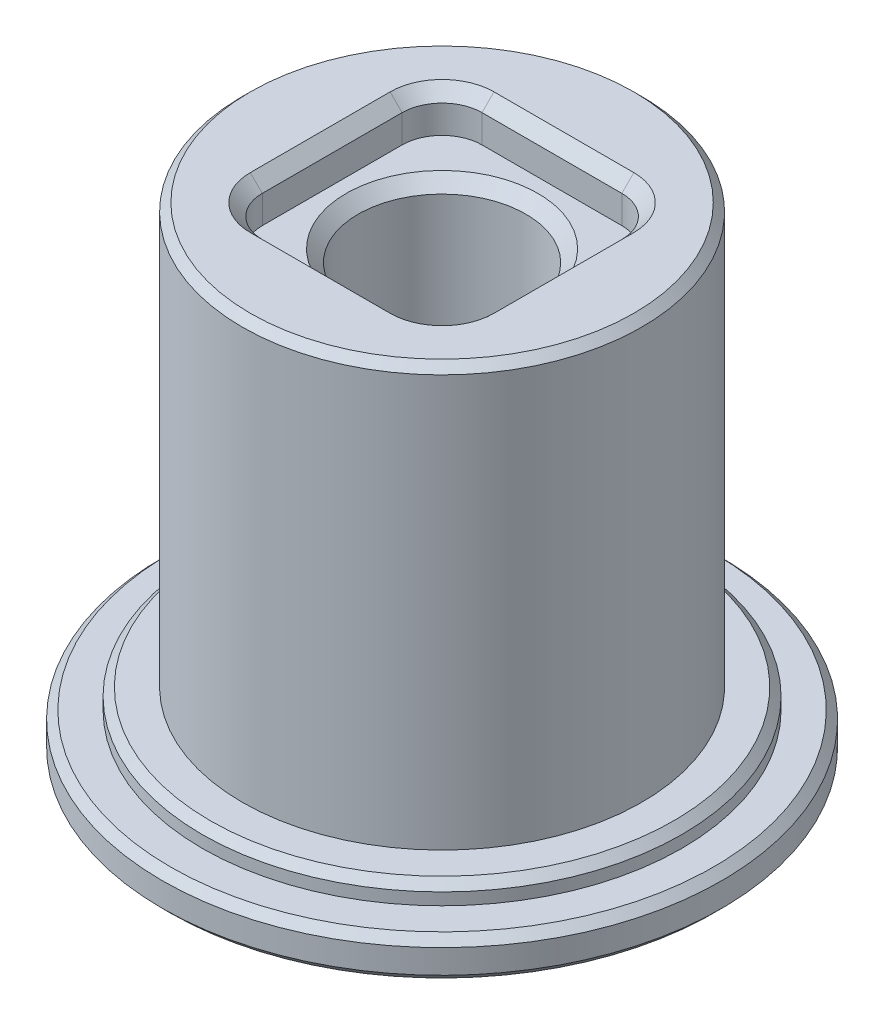
ISO-10303-21;
HEADER;
FILE_DESCRIPTION(('STEP AP214'),'2;1');
FILE_NAME('part.step','',(''),(''),'','','');
FILE_SCHEMA(('AUTOMOTIVE_DESIGN { 1 0 10303 214 1 1 1 1 }'));
ENDSEC;
DATA;
#1=APPLICATION_CONTEXT('core data for automotive mechanical design processes');
#2=APPLICATION_PROTOCOL_DEFINITION('international standard','automotive_design',2000,#1);
#3=PRODUCT_CONTEXT('',#1,'mechanical');
#4=PRODUCT('Part','Part','',(#3));
#5=PRODUCT_RELATED_PRODUCT_CATEGORY('part','',(#4));
#6=PRODUCT_DEFINITION_FORMATION('','',#4);
#7=PRODUCT_DEFINITION_CONTEXT('part definition',#1,'design');
#8=PRODUCT_DEFINITION('design','',#6,#7);
#9=PRODUCT_DEFINITION_SHAPE('','',#8);
#10=(LENGTH_UNIT() NAMED_UNIT(*) SI_UNIT(.MILLI.,.METRE.));
#11=(NAMED_UNIT(*) PLANE_ANGLE_UNIT() SI_UNIT($,.RADIAN.));
#12=(NAMED_UNIT(*) SI_UNIT($,.STERADIAN.) SOLID_ANGLE_UNIT());
#13=UNCERTAINTY_MEASURE_WITH_UNIT(LENGTH_MEASURE(1.E-05),#10,'distance_accuracy_value','');
#14=(GEOMETRIC_REPRESENTATION_CONTEXT(3) GLOBAL_UNCERTAINTY_ASSIGNED_CONTEXT((#13)) GLOBAL_UNIT_ASSIGNED_CONTEXT((#10,
#11,#12)) REPRESENTATION_CONTEXT('',''));
#15=CARTESIAN_POINT('',(0.,0.,0.));
#16=DIRECTION('',(0.,0.,1.));
#17=DIRECTION('',(1.,0.,0.));
#18=AXIS2_PLACEMENT_3D('',#15,#16,#17);
#19=CARTESIAN_POINT('',(0.,12.,0.));
#20=DIRECTION('',(0.,-1.,0.));
#21=DIRECTION('',(0.,0.,-1.));
#22=AXIS2_PLACEMENT_3D('',#19,#20,#21);
#23=CYLINDRICAL_SURFACE('',#22,4.25);
#24=CARTESIAN_POINT('',(0.,0.300000000000005,0.));
#25=DIRECTION('',(0.,1.,0.));
#26=DIRECTION('',(0.,0.,1.));
#27=AXIS2_PLACEMENT_3D('',#24,#25,#26);
#28=CIRCLE('',#27,4.25);
#29=CARTESIAN_POINT('',(0.,0.300000000000005,-4.25));
#30=VERTEX_POINT('',#29);
#31=EDGE_CURVE('E215',#30,#30,#28,.F.);
#32=ORIENTED_EDGE('',*,*,#31,.T.);
#33=EDGE_LOOP('',(#32));
#34=FACE_BOUND('',#33,.T.);
#35=CARTESIAN_POINT('',(0.,5.,0.));
#36=DIRECTION('',(0.,1.,0.));
#37=DIRECTION('',(0.,0.,1.));
#38=AXIS2_PLACEMENT_3D('',#35,#36,#37);
#39=CIRCLE('',#38,4.25);
#40=CARTESIAN_POINT('',(0.,5.,4.25));
#41=VERTEX_POINT('',#40);
#42=EDGE_CURVE('E285',#41,#41,#39,.T.);
#43=ORIENTED_EDGE('',*,*,#42,.T.);
#44=EDGE_LOOP('',(#43));
#45=FACE_BOUND('',#44,.T.);
#46=ADVANCED_FACE('F43',(#34,#45),#23,.F.);
#47=CARTESIAN_POINT('',(0.,1.,0.));
#48=DIRECTION('',(0.,-1.,0.));
#49=DIRECTION('',(0.,0.,-1.));
#50=AXIS2_PLACEMENT_3D('',#47,#48,#49);
#51=CYLINDRICAL_SURFACE('',#50,7.);
#52=CARTESIAN_POINT('',(0.,0.800000000000001,0.));
#53=DIRECTION('',(0.,1.,0.));
#54=DIRECTION('',(0.,0.,1.));
#55=AXIS2_PLACEMENT_3D('',#52,#53,#54);
#56=CIRCLE('',#55,7.);
#57=CARTESIAN_POINT('',(0.,0.800000000000001,7.));
#58=VERTEX_POINT('',#57);
#59=EDGE_CURVE('E206',#58,#58,#56,.F.);
#60=ORIENTED_EDGE('',*,*,#59,.T.);
#61=EDGE_LOOP('',(#60));
#62=FACE_BOUND('',#61,.T.);
#63=CARTESIAN_POINT('',(0.,0.200000000000003,0.));
#64=DIRECTION('',(0.,1.,0.));
#65=DIRECTION('',(0.,0.,1.));
#66=AXIS2_PLACEMENT_3D('',#63,#64,#65);
#67=CIRCLE('',#66,7.);
#68=CARTESIAN_POINT('',(0.,0.200000000000003,7.));
#69=VERTEX_POINT('',#68);
#70=EDGE_CURVE('E203',#69,#69,#67,.T.);
#71=ORIENTED_EDGE('',*,*,#70,.T.);
#72=EDGE_LOOP('',(#71));
#73=FACE_BOUND('',#72,.T.);
#74=ADVANCED_FACE('F309',(#62,#73),#51,.T.);
#75=CARTESIAN_POINT('',(0.,1.,0.));
#76=DIRECTION('',(0.,1.,0.));
#77=DIRECTION('',(0.,0.,1.));
#78=AXIS2_PLACEMENT_3D('',#75,#76,#77);
#79=PLANE('',#78);
#80=CARTESIAN_POINT('',(0.,1.,0.));
#81=DIRECTION('',(0.,1.,0.));
#82=DIRECTION('',(0.,0.,1.));
#83=AXIS2_PLACEMENT_3D('',#80,#81,#82);
#84=CIRCLE('',#83,6.8);
#85=CARTESIAN_POINT('',(0.,1.,6.8));
#86=VERTEX_POINT('',#85);
#87=EDGE_CURVE('E200',#86,#86,#84,.T.);
#88=ORIENTED_EDGE('',*,*,#87,.T.);
#89=EDGE_LOOP('',(#88));
#90=FACE_BOUND('',#89,.T.);
#91=CARTESIAN_POINT('',(0.,1.,0.));
#92=DIRECTION('',(0.,1.,0.));
#93=DIRECTION('',(0.,0.,1.));
#94=AXIS2_PLACEMENT_3D('',#91,#92,#93);
#95=CIRCLE('',#94,6.);
#96=CARTESIAN_POINT('',(0.,1.,6.));
#97=VERTEX_POINT('',#96);
#98=EDGE_CURVE('E162',#97,#97,#95,.T.);
#99=ORIENTED_EDGE('',*,*,#98,.F.);
#100=EDGE_LOOP('',(#99));
#101=FACE_BOUND('',#100,.T.);
#102=ADVANCED_FACE('F314',(#90,#101),#79,.T.);
#103=CARTESIAN_POINT('',(0.,0.,0.));
#104=DIRECTION('',(0.,1.,0.));
#105=DIRECTION('',(0.,0.,1.));
#106=AXIS2_PLACEMENT_3D('',#103,#104,#105);
#107=PLANE('',#106);
#108=CARTESIAN_POINT('',(0.,0.,0.));
#109=DIRECTION('',(0.,1.,0.));
#110=DIRECTION('',(0.,0.,1.));
#111=AXIS2_PLACEMENT_3D('',#108,#109,#110);
#112=CIRCLE('',#111,4.55000000000001);
#113=CARTESIAN_POINT('',(0.,0.,-4.55000000000001));
#114=VERTEX_POINT('',#113);
#115=EDGE_CURVE('E212',#114,#114,#112,.T.);
#116=ORIENTED_EDGE('',*,*,#115,.T.);
#117=EDGE_LOOP('',(#116));
#118=FACE_BOUND('',#117,.T.);
#119=CARTESIAN_POINT('',(0.,0.,0.));
#120=DIRECTION('',(0.,1.,0.));
#121=DIRECTION('',(0.,0.,1.));
#122=AXIS2_PLACEMENT_3D('',#119,#120,#121);
#123=CIRCLE('',#122,6.8);
#124=CARTESIAN_POINT('',(0.,0.,6.8));
#125=VERTEX_POINT('',#124);
#126=EDGE_CURVE('E209',#125,#125,#123,.F.);
#127=ORIENTED_EDGE('',*,*,#126,.T.);
#128=EDGE_LOOP('',(#127));
#129=FACE_BOUND('',#128,.T.);
#130=ADVANCED_FACE('F304',(#118,#129),#107,.F.);
#131=CARTESIAN_POINT('',(0.,1.5,0.));
#132=DIRECTION('',(0.,-1.,0.));
#133=DIRECTION('',(0.,0.,-1.));
#134=AXIS2_PLACEMENT_3D('',#131,#132,#133);
#135=CYLINDRICAL_SURFACE('',#134,6.);
#136=CARTESIAN_POINT('',(0.,1.3,0.));
#137=DIRECTION('',(0.,1.,0.));
#138=DIRECTION('',(0.,0.,1.));
#139=AXIS2_PLACEMENT_3D('',#136,#137,#138);
#140=CIRCLE('',#139,6.);
#141=CARTESIAN_POINT('',(0.,1.3,6.));
#142=VERTEX_POINT('',#141);
#143=EDGE_CURVE('E191',#142,#142,#140,.F.);
#144=ORIENTED_EDGE('',*,*,#143,.T.);
#145=EDGE_LOOP('',(#144));
#146=FACE_BOUND('',#145,.T.);
#147=ORIENTED_EDGE('',*,*,#98,.T.);
#148=EDGE_LOOP('',(#147));
#149=FACE_BOUND('',#148,.T.);
#150=ADVANCED_FACE('F294',(#146,#149),#135,.T.);
#151=CARTESIAN_POINT('',(0.,1.5,0.));
#152=DIRECTION('',(0.,1.,0.));
#153=DIRECTION('',(0.,0.,1.));
#154=AXIS2_PLACEMENT_3D('',#151,#152,#153);
#155=PLANE('',#154);
#156=CARTESIAN_POINT('',(0.,1.5,0.));
#157=DIRECTION('',(0.,1.,0.));
#158=DIRECTION('',(0.,0.,1.));
#159=AXIS2_PLACEMENT_3D('',#156,#157,#158);
#160=CIRCLE('',#159,5.8);
#161=CARTESIAN_POINT('',(0.,1.5,5.8));
#162=VERTEX_POINT('',#161);
#163=EDGE_CURVE('E188',#162,#162,#160,.T.);
#164=ORIENTED_EDGE('',*,*,#163,.T.);
#165=EDGE_LOOP('',(#164));
#166=FACE_BOUND('',#165,.T.);
#167=CARTESIAN_POINT('',(0.,1.5,0.));
#168=DIRECTION('',(0.,1.,0.));
#169=DIRECTION('',(0.,0.,1.));
#170=AXIS2_PLACEMENT_3D('',#167,#168,#169);
#171=CIRCLE('',#170,5.);
#172=CARTESIAN_POINT('',(0.,1.5,5.));
#173=VERTEX_POINT('',#172);
#174=EDGE_CURVE('E167',#173,#173,#171,.T.);
#175=ORIENTED_EDGE('',*,*,#174,.F.);
#176=EDGE_LOOP('',(#175));
#177=FACE_BOUND('',#176,.T.);
#178=ADVANCED_FACE('F292',(#166,#177),#155,.T.);
#179=CARTESIAN_POINT('',(0.,12.,0.));
#180=DIRECTION('',(0.,-1.,0.));
#181=DIRECTION('',(0.,0.,-1.));
#182=AXIS2_PLACEMENT_3D('',#179,#180,#181);
#183=CYLINDRICAL_SURFACE('',#182,5.);
#184=CARTESIAN_POINT('',(0.,11.8,0.));
#185=DIRECTION('',(0.,1.,0.));
#186=DIRECTION('',(0.,0.,1.));
#187=AXIS2_PLACEMENT_3D('',#184,#185,#186);
#188=CIRCLE('',#187,5.);
#189=CARTESIAN_POINT('',(0.,11.8,5.));
#190=VERTEX_POINT('',#189);
#191=EDGE_CURVE('E197',#190,#190,#188,.F.);
#192=ORIENTED_EDGE('',*,*,#191,.T.);
#193=EDGE_LOOP('',(#192));
#194=FACE_BOUND('',#193,.T.);
#195=ORIENTED_EDGE('',*,*,#174,.T.);
#196=EDGE_LOOP('',(#195));
#197=FACE_BOUND('',#196,.T.);
#198=ADVANCED_FACE('F290',(#194,#197),#183,.T.);
#199=CARTESIAN_POINT('',(0.,12.,0.));
#200=DIRECTION('',(0.,1.,0.));
#201=DIRECTION('',(0.,0.,1.));
#202=AXIS2_PLACEMENT_3D('',#199,#200,#201);
#203=PLANE('',#202);
#204=CARTESIAN_POINT('',(1.75,12.,1.75));
#205=DIRECTION('',(0.,1.,0.));
#206=DIRECTION('',(0.,0.,1.));
#207=AXIS2_PLACEMENT_3D('',#204,#205,#206);
#208=CIRCLE('',#207,1.3);
#209=CARTESIAN_POINT('',(3.05000000000001,12.,1.75));
#210=VERTEX_POINT('',#209);
#211=CARTESIAN_POINT('',(1.75,12.,3.05));
#212=VERTEX_POINT('',#211);
#213=EDGE_CURVE('E236',#210,#212,#208,.F.);
#214=ORIENTED_EDGE('',*,*,#213,.T.);
#215=DIRECTION('',(-1.,0.,0.));
#216=VECTOR('',#215,1.);
#217=CARTESIAN_POINT('',(0.,12.,3.05000000000001));
#218=LINE('',#217,#216);
#219=CARTESIAN_POINT('',(-1.75,12.,3.05));
#220=VERTEX_POINT('',#219);
#221=EDGE_CURVE('E240',#212,#220,#218,.T.);
#222=ORIENTED_EDGE('',*,*,#221,.T.);
#223=CARTESIAN_POINT('',(-1.75,12.,1.75));
#224=DIRECTION('',(0.,1.,0.));
#225=DIRECTION('',(0.,0.,1.));
#226=AXIS2_PLACEMENT_3D('',#223,#224,#225);
#227=CIRCLE('',#226,1.3);
#228=CARTESIAN_POINT('',(-3.05,12.,1.75));
#229=VERTEX_POINT('',#228);
#230=EDGE_CURVE('E238',#220,#229,#227,.F.);
#231=ORIENTED_EDGE('',*,*,#230,.T.);
#232=DIRECTION('',(0.,0.,-1.));
#233=VECTOR('',#232,1.);
#234=CARTESIAN_POINT('',(-3.05,12.,-1.75));
#235=LINE('',#234,#233);
#236=CARTESIAN_POINT('',(-3.05,12.,-1.75));
#237=VERTEX_POINT('',#236);
#238=EDGE_CURVE('E232',#229,#237,#235,.T.);
#239=ORIENTED_EDGE('',*,*,#238,.T.);
#240=CARTESIAN_POINT('',(-1.75,12.,-1.75));
#241=DIRECTION('',(0.,1.,0.));
#242=DIRECTION('',(0.,0.,1.));
#243=AXIS2_PLACEMENT_3D('',#240,#241,#242);
#244=CIRCLE('',#243,1.3);
#245=CARTESIAN_POINT('',(-1.75,12.,-3.05));
#246=VERTEX_POINT('',#245);
#247=EDGE_CURVE('E230',#237,#246,#244,.F.);
#248=ORIENTED_EDGE('',*,*,#247,.T.);
#249=DIRECTION('',(1.,0.,0.));
#250=VECTOR('',#249,1.);
#251=CARTESIAN_POINT('',(1.75,12.,-3.05));
#252=LINE('',#251,#250);
#253=CARTESIAN_POINT('',(1.75,12.,-3.05));
#254=VERTEX_POINT('',#253);
#255=EDGE_CURVE('E226',#246,#254,#252,.T.);
#256=ORIENTED_EDGE('',*,*,#255,.T.);
#257=CARTESIAN_POINT('',(1.75,12.,-1.75));
#258=DIRECTION('',(0.,1.,0.));
#259=DIRECTION('',(0.,0.,1.));
#260=AXIS2_PLACEMENT_3D('',#257,#258,#259);
#261=CIRCLE('',#260,1.3);
#262=CARTESIAN_POINT('',(3.05,12.,-1.75));
#263=VERTEX_POINT('',#262);
#264=EDGE_CURVE('E228',#254,#263,#261,.F.);
#265=ORIENTED_EDGE('',*,*,#264,.T.);
#266=DIRECTION('',(0.,0.,1.));
#267=VECTOR('',#266,1.);
#268=CARTESIAN_POINT('',(3.05000000000001,12.,0.));
#269=LINE('',#268,#267);
#270=EDGE_CURVE('E234',#263,#210,#269,.T.);
#271=ORIENTED_EDGE('',*,*,#270,.T.);
#272=EDGE_LOOP('',(#214,#222,#231,#239,#248,#256,#265,#271));
#273=FACE_BOUND('',#272,.T.);
#274=CARTESIAN_POINT('',(0.,12.,0.));
#275=DIRECTION('',(0.,1.,0.));
#276=DIRECTION('',(0.,0.,1.));
#277=AXIS2_PLACEMENT_3D('',#274,#275,#276);
#278=CIRCLE('',#277,4.80000000000001);
#279=CARTESIAN_POINT('',(0.,12.,4.80000000000001));
#280=VERTEX_POINT('',#279);
#281=EDGE_CURVE('E194',#280,#280,#278,.T.);
#282=ORIENTED_EDGE('',*,*,#281,.T.);
#283=EDGE_LOOP('',(#282));
#284=FACE_BOUND('',#283,.T.);
#285=ADVANCED_FACE('F301',(#273,#284),#203,.T.);
#286=CARTESIAN_POINT('',(2.75,12.,0.));
#287=DIRECTION('',(-1.,0.,0.));
#288=DIRECTION('',(0.,0.,1.));
#289=AXIS2_PLACEMENT_3D('',#286,#287,#288);
#290=PLANE('',#289);
#291=DIRECTION('',(0.,-1.,0.));
#292=VECTOR('',#291,1.);
#293=CARTESIAN_POINT('',(2.75,12.,1.75));
#294=LINE('',#293,#292);
#295=CARTESIAN_POINT('',(2.75,11.,1.75));
#296=VERTEX_POINT('',#295);
#297=CARTESIAN_POINT('',(2.75,11.7,1.75));
#298=VERTEX_POINT('',#297);
#299=EDGE_CURVE('E176',#296,#298,#294,.F.);
#300=ORIENTED_EDGE('',*,*,#299,.T.);
#301=DIRECTION('',(0.,0.,-1.));
#302=VECTOR('',#301,1.);
#303=CARTESIAN_POINT('',(2.75,11.7,0.));
#304=LINE('',#303,#302);
#305=CARTESIAN_POINT('',(2.75,11.7,-1.75));
#306=VERTEX_POINT('',#305);
#307=EDGE_CURVE('E243',#298,#306,#304,.T.);
#308=ORIENTED_EDGE('',*,*,#307,.T.);
#309=DIRECTION('',(0.,-1.,0.));
#310=VECTOR('',#309,1.);
#311=CARTESIAN_POINT('',(2.75,12.,-1.75));
#312=LINE('',#311,#310);
#313=CARTESIAN_POINT('',(2.75,11.,-1.75));
#314=VERTEX_POINT('',#313);
#315=EDGE_CURVE('E174',#306,#314,#312,.T.);
#316=ORIENTED_EDGE('',*,*,#315,.T.);
#317=DIRECTION('',(0.,0.,-1.));
#318=VECTOR('',#317,1.);
#319=CARTESIAN_POINT('',(2.75,11.,0.));
#320=LINE('',#319,#318);
#321=EDGE_CURVE('E156',#296,#314,#320,.T.);
#322=ORIENTED_EDGE('',*,*,#321,.F.);
#323=EDGE_LOOP('',(#300,#308,#316,#322));
#324=FACE_BOUND('',#323,.T.);
#325=ADVANCED_FACE('F321',(#324),#290,.T.);
#326=CARTESIAN_POINT('',(0.,12.,2.75));
#327=DIRECTION('',(0.,0.,-1.));
#328=DIRECTION('',(-1.,0.,0.));
#329=AXIS2_PLACEMENT_3D('',#326,#327,#328);
#330=PLANE('',#329);
#331=DIRECTION('',(0.,-1.,0.));
#332=VECTOR('',#331,1.);
#333=CARTESIAN_POINT('',(-1.75,12.,2.75));
#334=LINE('',#333,#332);
#335=CARTESIAN_POINT('',(-1.75,11.,2.75));
#336=VERTEX_POINT('',#335);
#337=CARTESIAN_POINT('',(-1.75,11.7,2.75));
#338=VERTEX_POINT('',#337);
#339=EDGE_CURVE('E151',#336,#338,#334,.F.);
#340=ORIENTED_EDGE('',*,*,#339,.T.);
#341=DIRECTION('',(1.,0.,0.));
#342=VECTOR('',#341,1.);
#343=CARTESIAN_POINT('',(0.,11.7,2.75));
#344=LINE('',#343,#342);
#345=CARTESIAN_POINT('',(1.75,11.7,2.75));
#346=VERTEX_POINT('',#345);
#347=EDGE_CURVE('E224',#338,#346,#344,.T.);
#348=ORIENTED_EDGE('',*,*,#347,.T.);
#349=DIRECTION('',(0.,-1.,0.));
#350=VECTOR('',#349,1.);
#351=CARTESIAN_POINT('',(1.75,11.,2.75));
#352=LINE('',#351,#350);
#353=CARTESIAN_POINT('',(1.75,11.,2.75));
#354=VERTEX_POINT('',#353);
#355=EDGE_CURVE('E154',#346,#354,#352,.T.);
#356=ORIENTED_EDGE('',*,*,#355,.T.);
#357=DIRECTION('',(1.,0.,0.));
#358=VECTOR('',#357,1.);
#359=CARTESIAN_POINT('',(0.,11.,2.75));
#360=LINE('',#359,#358);
#361=EDGE_CURVE('E138',#336,#354,#360,.T.);
#362=ORIENTED_EDGE('',*,*,#361,.F.);
#363=EDGE_LOOP('',(#340,#348,#356,#362));
#364=FACE_BOUND('',#363,.T.);
#365=ADVANCED_FACE('F149',(#364),#330,.T.);
#366=CARTESIAN_POINT('',(-2.75,12.,0.));
#367=DIRECTION('',(-1.,0.,0.));
#368=DIRECTION('',(0.,0.,1.));
#369=AXIS2_PLACEMENT_3D('',#366,#367,#368);
#370=PLANE('',#369);
#371=DIRECTION('',(0.,-1.,0.));
#372=VECTOR('',#371,1.);
#373=CARTESIAN_POINT('',(-2.75,12.,-1.75));
#374=LINE('',#373,#372);
#375=CARTESIAN_POINT('',(-2.75,11.,-1.75));
#376=VERTEX_POINT('',#375);
#377=CARTESIAN_POINT('',(-2.75,11.7,-1.75));
#378=VERTEX_POINT('',#377);
#379=EDGE_CURVE('E179',#376,#378,#374,.F.);
#380=ORIENTED_EDGE('',*,*,#379,.T.);
#381=DIRECTION('',(0.,0.,1.));
#382=VECTOR('',#381,1.);
#383=CARTESIAN_POINT('',(-2.75,11.7,1.75));
#384=LINE('',#383,#382);
#385=CARTESIAN_POINT('',(-2.75,11.7,1.75));
#386=VERTEX_POINT('',#385);
#387=EDGE_CURVE('E245',#378,#386,#384,.T.);
#388=ORIENTED_EDGE('',*,*,#387,.T.);
#389=DIRECTION('',(0.,-1.,0.));
#390=VECTOR('',#389,1.);
#391=CARTESIAN_POINT('',(-2.75,12.,1.75));
#392=LINE('',#391,#390);
#393=CARTESIAN_POINT('',(-2.75,11.,1.75));
#394=VERTEX_POINT('',#393);
#395=EDGE_CURVE('E182',#386,#394,#392,.T.);
#396=ORIENTED_EDGE('',*,*,#395,.T.);
#397=DIRECTION('',(0.,0.,-1.));
#398=VECTOR('',#397,1.);
#399=CARTESIAN_POINT('',(-2.75,11.,0.));
#400=LINE('',#399,#398);
#401=EDGE_CURVE('E140',#394,#376,#400,.T.);
#402=ORIENTED_EDGE('',*,*,#401,.T.);
#403=EDGE_LOOP('',(#380,#388,#396,#402));
#404=FACE_BOUND('',#403,.T.);
#405=ADVANCED_FACE('F328',(#404),#370,.F.);
#406=CARTESIAN_POINT('',(0.,12.,-2.75));
#407=DIRECTION('',(0.,0.,-1.));
#408=DIRECTION('',(-1.,0.,0.));
#409=AXIS2_PLACEMENT_3D('',#406,#407,#408);
#410=PLANE('',#409);
#411=DIRECTION('',(0.,-1.,0.));
#412=VECTOR('',#411,1.);
#413=CARTESIAN_POINT('',(1.75,12.,-2.75));
#414=LINE('',#413,#412);
#415=CARTESIAN_POINT('',(1.75,11.,-2.75));
#416=VERTEX_POINT('',#415);
#417=CARTESIAN_POINT('',(1.75,11.7,-2.75));
#418=VERTEX_POINT('',#417);
#419=EDGE_CURVE('E186',#416,#418,#414,.F.);
#420=ORIENTED_EDGE('',*,*,#419,.T.);
#421=DIRECTION('',(-1.,0.,0.));
#422=VECTOR('',#421,1.);
#423=CARTESIAN_POINT('',(-1.75,11.7,-2.75));
#424=LINE('',#423,#422);
#425=CARTESIAN_POINT('',(-1.75,11.7,-2.75));
#426=VERTEX_POINT('',#425);
#427=EDGE_CURVE('E11',#418,#426,#424,.T.);
#428=ORIENTED_EDGE('',*,*,#427,.T.);
#429=DIRECTION('',(0.,-1.,0.));
#430=VECTOR('',#429,1.);
#431=CARTESIAN_POINT('',(-1.75,11.,-2.75));
#432=LINE('',#431,#430);
#433=CARTESIAN_POINT('',(-1.75,11.,-2.75));
#434=VERTEX_POINT('',#433);
#435=EDGE_CURVE('E184',#426,#434,#432,.T.);
#436=ORIENTED_EDGE('',*,*,#435,.T.);
#437=DIRECTION('',(1.,0.,0.));
#438=VECTOR('',#437,1.);
#439=CARTESIAN_POINT('',(0.,11.,-2.75));
#440=LINE('',#439,#438);
#441=EDGE_CURVE('E757',#434,#416,#440,.T.);
#442=ORIENTED_EDGE('',*,*,#441,.T.);
#443=EDGE_LOOP('',(#420,#428,#436,#442));
#444=FACE_BOUND('',#443,.T.);
#445=ADVANCED_FACE('F331',(#444),#410,.F.);
#446=CARTESIAN_POINT('',(0.,5.,0.));
#447=DIRECTION('',(0.,1.,0.));
#448=DIRECTION('',(0.,0.,1.));
#449=AXIS2_PLACEMENT_3D('',#446,#447,#448);
#450=PLANE('',#449);
#451=ORIENTED_EDGE('',*,*,#42,.F.);
#452=EDGE_LOOP('',(#451));
#453=FACE_BOUND('',#452,.T.);
#454=CARTESIAN_POINT('',(0.,5.,0.));
#455=DIRECTION('',(0.,1.,0.));
#456=DIRECTION('',(0.,0.,1.));
#457=AXIS2_PLACEMENT_3D('',#454,#455,#456);
#458=CIRCLE('',#457,2.1);
#459=CARTESIAN_POINT('',(0.,5.,2.1));
#460=VERTEX_POINT('',#459);
#461=EDGE_CURVE('E157',#460,#460,#458,.T.);
#462=ORIENTED_EDGE('',*,*,#461,.T.);
#463=EDGE_LOOP('',(#462));
#464=FACE_BOUND('',#463,.T.);
#465=ADVANCED_FACE('F335',(#453,#464),#450,.F.);
#466=CARTESIAN_POINT('',(0.,11.,0.));
#467=DIRECTION('',(0.,-1.,0.));
#468=DIRECTION('',(0.,0.,-1.));
#469=AXIS2_PLACEMENT_3D('',#466,#467,#468);
#470=CYLINDRICAL_SURFACE('',#469,2.1);
#471=CARTESIAN_POINT('',(0.,10.7,0.));
#472=DIRECTION('',(0.,1.,0.));
#473=DIRECTION('',(0.,0.,1.));
#474=AXIS2_PLACEMENT_3D('',#471,#472,#473);
#475=CIRCLE('',#474,2.1);
#476=CARTESIAN_POINT('',(0.,10.7,2.1));
#477=VERTEX_POINT('',#476);
#478=EDGE_CURVE('E218',#477,#477,#475,.T.);
#479=ORIENTED_EDGE('',*,*,#478,.T.);
#480=EDGE_LOOP('',(#479));
#481=FACE_BOUND('',#480,.T.);
#482=ORIENTED_EDGE('',*,*,#461,.F.);
#483=EDGE_LOOP('',(#482));
#484=FACE_BOUND('',#483,.T.);
#485=ADVANCED_FACE('F338',(#481,#484),#470,.F.);
#486=CARTESIAN_POINT('',(0.,11.,0.));
#487=DIRECTION('',(0.,1.,0.));
#488=DIRECTION('',(0.,0.,1.));
#489=AXIS2_PLACEMENT_3D('',#486,#487,#488);
#490=PLANE('',#489);
#491=CARTESIAN_POINT('',(0.,11.,0.));
#492=DIRECTION('',(0.,1.,0.));
#493=DIRECTION('',(0.,0.,1.));
#494=AXIS2_PLACEMENT_3D('',#491,#492,#493);
#495=CIRCLE('',#494,2.40000000000001);
#496=CARTESIAN_POINT('',(0.,11.,2.40000000000001));
#497=VERTEX_POINT('',#496);
#498=EDGE_CURVE('E221',#497,#497,#495,.F.);
#499=ORIENTED_EDGE('',*,*,#498,.T.);
#500=EDGE_LOOP('',(#499));
#501=FACE_BOUND('',#500,.T.);
#502=ORIENTED_EDGE('',*,*,#361,.T.);
#503=CARTESIAN_POINT('',(1.75,11.,1.75));
#504=DIRECTION('',(0.,1.,0.));
#505=DIRECTION('',(0.,0.,1.));
#506=AXIS2_PLACEMENT_3D('',#503,#504,#505);
#507=CIRCLE('',#506,1.);
#508=EDGE_CURVE('E144',#354,#296,#507,.T.);
#509=ORIENTED_EDGE('',*,*,#508,.T.);
#510=ORIENTED_EDGE('',*,*,#321,.T.);
#511=CARTESIAN_POINT('',(1.75,11.,-1.75));
#512=DIRECTION('',(0.,1.,0.));
#513=DIRECTION('',(0.,0.,1.));
#514=AXIS2_PLACEMENT_3D('',#511,#512,#513);
#515=CIRCLE('',#514,1.);
#516=EDGE_CURVE('E145',#314,#416,#515,.T.);
#517=ORIENTED_EDGE('',*,*,#516,.T.);
#518=ORIENTED_EDGE('',*,*,#441,.F.);
#519=CARTESIAN_POINT('',(-1.75,11.,-1.75));
#520=DIRECTION('',(0.,1.,0.));
#521=DIRECTION('',(0.,0.,1.));
#522=AXIS2_PLACEMENT_3D('',#519,#520,#521);
#523=CIRCLE('',#522,1.);
#524=EDGE_CURVE('E164',#434,#376,#523,.T.);
#525=ORIENTED_EDGE('',*,*,#524,.T.);
#526=ORIENTED_EDGE('',*,*,#401,.F.);
#527=CARTESIAN_POINT('',(-1.75,11.,1.75));
#528=DIRECTION('',(0.,1.,0.));
#529=DIRECTION('',(0.,0.,1.));
#530=AXIS2_PLACEMENT_3D('',#527,#528,#529);
#531=CIRCLE('',#530,1.);
#532=EDGE_CURVE('E135',#394,#336,#531,.T.);
#533=ORIENTED_EDGE('',*,*,#532,.T.);
#534=EDGE_LOOP('',(#502,#509,#510,#517,#518,#525,#526,#533));
#535=FACE_BOUND('',#534,.T.);
#536=ADVANCED_FACE('F137',(#501,#535),#490,.T.);
#537=CARTESIAN_POINT('',(1.75,12.,1.75));
#538=DIRECTION('',(0.,1.,0.));
#539=DIRECTION('',(0.,0.,1.));
#540=AXIS2_PLACEMENT_3D('',#537,#538,#539);
#541=CYLINDRICAL_SURFACE('',#540,1.);
#542=ORIENTED_EDGE('',*,*,#355,.F.);
#543=CARTESIAN_POINT('',(1.75,11.7,1.75));
#544=DIRECTION('',(0.,1.,0.));
#545=DIRECTION('',(0.,0.,1.));
#546=AXIS2_PLACEMENT_3D('',#543,#544,#545);
#547=CIRCLE('',#546,1.);
#548=EDGE_CURVE('E248',#346,#298,#547,.T.);
#549=ORIENTED_EDGE('',*,*,#548,.T.);
#550=ORIENTED_EDGE('',*,*,#299,.F.);
#551=ORIENTED_EDGE('',*,*,#508,.F.);
#552=EDGE_LOOP('',(#542,#549,#550,#551));
#553=FACE_BOUND('',#552,.T.);
#554=ADVANCED_FACE('F344',(#553),#541,.F.);
#555=CARTESIAN_POINT('',(-1.75,12.,1.75));
#556=DIRECTION('',(0.,-1.,0.));
#557=DIRECTION('',(0.,0.,-1.));
#558=AXIS2_PLACEMENT_3D('',#555,#556,#557);
#559=CYLINDRICAL_SURFACE('',#558,1.);
#560=ORIENTED_EDGE('',*,*,#395,.F.);
#561=CARTESIAN_POINT('',(-1.75,11.7,1.75));
#562=DIRECTION('',(0.,1.,0.));
#563=DIRECTION('',(0.,0.,1.));
#564=AXIS2_PLACEMENT_3D('',#561,#562,#563);
#565=CIRCLE('',#564,1.);
#566=EDGE_CURVE('E161',#386,#338,#565,.T.);
#567=ORIENTED_EDGE('',*,*,#566,.T.);
#568=ORIENTED_EDGE('',*,*,#339,.F.);
#569=ORIENTED_EDGE('',*,*,#532,.F.);
#570=EDGE_LOOP('',(#560,#567,#568,#569));
#571=FACE_BOUND('',#570,.T.);
#572=ADVANCED_FACE('F159',(#571),#559,.F.);
#573=CARTESIAN_POINT('',(1.75,12.,-1.75));
#574=DIRECTION('',(0.,-1.,0.));
#575=DIRECTION('',(0.,0.,-1.));
#576=AXIS2_PLACEMENT_3D('',#573,#574,#575);
#577=CYLINDRICAL_SURFACE('',#576,1.);
#578=ORIENTED_EDGE('',*,*,#315,.F.);
#579=CARTESIAN_POINT('',(1.75,11.7,-1.75));
#580=DIRECTION('',(0.,1.,0.));
#581=DIRECTION('',(0.,0.,1.));
#582=AXIS2_PLACEMENT_3D('',#579,#580,#581);
#583=CIRCLE('',#582,1.);
#584=EDGE_CURVE('E53',#306,#418,#583,.T.);
#585=ORIENTED_EDGE('',*,*,#584,.T.);
#586=ORIENTED_EDGE('',*,*,#419,.F.);
#587=ORIENTED_EDGE('',*,*,#516,.F.);
#588=EDGE_LOOP('',(#578,#585,#586,#587));
#589=FACE_BOUND('',#588,.T.);
#590=ADVANCED_FACE('F549',(#589),#577,.F.);
#591=CARTESIAN_POINT('',(-1.75,12.,-1.75));
#592=DIRECTION('',(0.,1.,0.));
#593=DIRECTION('',(0.,0.,1.));
#594=AXIS2_PLACEMENT_3D('',#591,#592,#593);
#595=CYLINDRICAL_SURFACE('',#594,1.);
#596=ORIENTED_EDGE('',*,*,#435,.F.);
#597=CARTESIAN_POINT('',(-1.75,11.7,-1.75));
#598=DIRECTION('',(0.,1.,0.));
#599=DIRECTION('',(0.,0.,1.));
#600=AXIS2_PLACEMENT_3D('',#597,#598,#599);
#601=CIRCLE('',#600,1.);
#602=EDGE_CURVE('E250',#426,#378,#601,.T.);
#603=ORIENTED_EDGE('',*,*,#602,.T.);
#604=ORIENTED_EDGE('',*,*,#379,.F.);
#605=ORIENTED_EDGE('',*,*,#524,.F.);
#606=EDGE_LOOP('',(#596,#603,#604,#605));
#607=FACE_BOUND('',#606,.T.);
#608=ADVANCED_FACE('F538',(#607),#595,.F.);
#609=CARTESIAN_POINT('',(0.,1.5,0.));
#610=DIRECTION('',(0.,-1.,0.));
#611=DIRECTION('',(0.,0.,-1.));
#612=AXIS2_PLACEMENT_3D('',#609,#610,#611);
#613=CONICAL_SURFACE('',#612,5.8,0.785398163397444);
#614=ORIENTED_EDGE('',*,*,#143,.F.);
#615=EDGE_LOOP('',(#614));
#616=FACE_BOUND('',#615,.T.);
#617=ORIENTED_EDGE('',*,*,#163,.F.);
#618=EDGE_LOOP('',(#617));
#619=FACE_BOUND('',#618,.T.);
#620=ADVANCED_FACE('F527',(#616,#619),#613,.T.);
#621=CARTESIAN_POINT('',(0.,12.,0.));
#622=DIRECTION('',(0.,-1.,0.));
#623=DIRECTION('',(0.,0.,-1.));
#624=AXIS2_PLACEMENT_3D('',#621,#622,#623);
#625=CONICAL_SURFACE('',#624,4.80000000000001,0.785398163397446);
#626=ORIENTED_EDGE('',*,*,#191,.F.);
#627=EDGE_LOOP('',(#626));
#628=FACE_BOUND('',#627,.T.);
#629=ORIENTED_EDGE('',*,*,#281,.F.);
#630=EDGE_LOOP('',(#629));
#631=FACE_BOUND('',#630,.T.);
#632=ADVANCED_FACE('F516',(#628,#631),#625,.T.);
#633=CARTESIAN_POINT('',(0.,1.,0.));
#634=DIRECTION('',(0.,-1.,0.));
#635=DIRECTION('',(0.,0.,-1.));
#636=AXIS2_PLACEMENT_3D('',#633,#634,#635);
#637=CONICAL_SURFACE('',#636,6.8,0.785398163397442);
#638=ORIENTED_EDGE('',*,*,#59,.F.);
#639=EDGE_LOOP('',(#638));
#640=FACE_BOUND('',#639,.T.);
#641=ORIENTED_EDGE('',*,*,#87,.F.);
#642=EDGE_LOOP('',(#641));
#643=FACE_BOUND('',#642,.T.);
#644=ADVANCED_FACE('F506',(#640,#643),#637,.T.);
#645=CARTESIAN_POINT('',(0.,0.200000000000003,0.));
#646=DIRECTION('',(0.,1.,0.));
#647=DIRECTION('',(0.,0.,1.));
#648=AXIS2_PLACEMENT_3D('',#645,#646,#647);
#649=CONICAL_SURFACE('',#648,7.,0.785398163397453);
#650=ORIENTED_EDGE('',*,*,#126,.F.);
#651=EDGE_LOOP('',(#650));
#652=FACE_BOUND('',#651,.T.);
#653=ORIENTED_EDGE('',*,*,#70,.F.);
#654=EDGE_LOOP('',(#653));
#655=FACE_BOUND('',#654,.T.);
#656=ADVANCED_FACE('F366',(#652,#655),#649,.T.);
#657=CARTESIAN_POINT('',(0.,0.,0.));
#658=DIRECTION('',(0.,-1.,0.));
#659=DIRECTION('',(0.,0.,-1.));
#660=AXIS2_PLACEMENT_3D('',#657,#658,#659);
#661=CONICAL_SURFACE('',#660,4.55000000000001,0.785398163397451);
#662=CARTESIAN_POINT('',(0.,0.300000000000005,-4.25));
#663=CARTESIAN_POINT('',(0.,0.296875000000005,-4.253125));
#664=CARTESIAN_POINT('',(0.,0.293750000000005,-4.25625));
#665=CARTESIAN_POINT('',(0.,0.287500000000005,-4.2625));
#666=CARTESIAN_POINT('',(0.,0.284375000000005,-4.265625));
#667=CARTESIAN_POINT('',(0.,0.278125000000005,-4.271875));
#668=CARTESIAN_POINT('',(0.,0.275000000000005,-4.275));
#669=CARTESIAN_POINT('',(0.,0.268750000000004,-4.28125));
#670=CARTESIAN_POINT('',(0.,0.265625000000005,-4.284375));
#671=CARTESIAN_POINT('',(0.,0.259375000000004,-4.290625));
#672=CARTESIAN_POINT('',(0.,0.256250000000004,-4.29375));
#673=CARTESIAN_POINT('',(0.,0.250000000000004,-4.3));
#674=CARTESIAN_POINT('',(0.,0.246875000000004,-4.303125));
#675=CARTESIAN_POINT('',(0.,0.240625000000004,-4.309375));
#676=CARTESIAN_POINT('',(0.,0.237500000000004,-4.3125));
#677=CARTESIAN_POINT('',(0.,0.231250000000004,-4.31875));
#678=CARTESIAN_POINT('',(0.,0.228125000000004,-4.321875));
#679=CARTESIAN_POINT('',(0.,0.221875000000004,-4.328125));
#680=CARTESIAN_POINT('',(0.,0.218750000000004,-4.33125));
#681=CARTESIAN_POINT('',(0.,0.212500000000004,-4.3375));
#682=CARTESIAN_POINT('',(0.,0.209375000000003,-4.340625));
#683=CARTESIAN_POINT('',(0.,0.203125000000003,-4.346875));
#684=CARTESIAN_POINT('',(0.,0.200000000000003,-4.35));
#685=CARTESIAN_POINT('',(0.,0.193750000000003,-4.35625));
#686=CARTESIAN_POINT('',(0.,0.190625000000003,-4.359375));
#687=CARTESIAN_POINT('',(0.,0.184375000000003,-4.365625));
#688=CARTESIAN_POINT('',(0.,0.181250000000003,-4.36875));
#689=CARTESIAN_POINT('',(0.,0.175000000000003,-4.375));
#690=CARTESIAN_POINT('',(0.,0.171875000000003,-4.378125));
#691=CARTESIAN_POINT('',(0.,0.165625000000003,-4.384375));
#692=CARTESIAN_POINT('',(0.,0.162500000000003,-4.3875));
#693=CARTESIAN_POINT('',(0.,0.156250000000003,-4.39375));
#694=CARTESIAN_POINT('',(0.,0.153125000000003,-4.396875));
#695=CARTESIAN_POINT('',(0.,0.146875000000002,-4.403125));
#696=CARTESIAN_POINT('',(0.,0.143750000000002,-4.40625));
#697=CARTESIAN_POINT('',(0.,0.137500000000002,-4.4125));
#698=CARTESIAN_POINT('',(0.,0.134375000000002,-4.415625));
#699=CARTESIAN_POINT('',(0.,0.128125000000002,-4.421875));
#700=CARTESIAN_POINT('',(0.,0.125000000000002,-4.425));
#701=CARTESIAN_POINT('',(0.,0.118750000000002,-4.43125));
#702=CARTESIAN_POINT('',(0.,0.115625000000002,-4.434375));
#703=CARTESIAN_POINT('',(0.,0.109375000000002,-4.440625));
#704=CARTESIAN_POINT('',(0.,0.106250000000002,-4.44375));
#705=CARTESIAN_POINT('',(0.,0.100000000000002,-4.45000000000001));
#706=CARTESIAN_POINT('',(0.,0.0968750000000017,-4.453125));
#707=CARTESIAN_POINT('',(0.,0.0906250000000016,-4.459375));
#708=CARTESIAN_POINT('',(0.,0.0875000000000014,-4.46250000000001));
#709=CARTESIAN_POINT('',(0.,0.0812500000000013,-4.46875000000001));
#710=CARTESIAN_POINT('',(0.,0.0781250000000014,-4.47187500000001));
#711=CARTESIAN_POINT('',(0.,0.0718750000000013,-4.47812500000001));
#712=CARTESIAN_POINT('',(0.,0.0687500000000012,-4.48125000000001));
#713=CARTESIAN_POINT('',(0.,0.062500000000001,-4.48750000000001));
#714=CARTESIAN_POINT('',(0.,0.0593750000000009,-4.49062500000001));
#715=CARTESIAN_POINT('',(0.,0.0531250000000009,-4.49687500000001));
#716=CARTESIAN_POINT('',(0.,0.0500000000000009,-4.50000000000001));
#717=CARTESIAN_POINT('',(0.,0.0437500000000008,-4.50625000000001));
#718=CARTESIAN_POINT('',(0.,0.0406250000000006,-4.50937500000001));
#719=CARTESIAN_POINT('',(0.,0.0343750000000005,-4.51562500000001));
#720=CARTESIAN_POINT('',(0.,0.0312500000000006,-4.51875000000001));
#721=CARTESIAN_POINT('',(0.,0.0250000000000005,-4.52500000000001));
#722=CARTESIAN_POINT('',(0.,0.0218750000000003,-4.52812500000001));
#723=CARTESIAN_POINT('',(0.,0.0156250000000002,-4.53437500000001));
#724=CARTESIAN_POINT('',(0.,0.0125000000000002,-4.53750000000001));
#725=CARTESIAN_POINT('',(0.,0.00625000000000026,-4.54375000000001));
#726=CARTESIAN_POINT('',(0.,0.00312500000000029,-4.54687500000001));
#727=CARTESIAN_POINT('',(0.,0.,-4.55000000000001));
#728=B_SPLINE_CURVE_WITH_KNOTS('',3,(#662,#663,#664,#665,#666,#667,#668,#669,#670,#671,#672,
#673,#674,#675,#676,#677,#678,#679,#680,#681,#682,#683,#684,#685,#686,#687,#688,#689,#690,#691,
#692,#693,#694,#695,#696,#697,#698,#699,#700,#701,#702,#703,#704,#705,#706,#707,#708,#709,#710,
#711,#712,#713,#714,#715,#716,#717,#718,#719,#720,#721,#722,#723,#724,#725,#726,#727),
.UNSPECIFIED.,.F.,.F.,(4,2,2,2,2,2,2,2,2,2,2,2,2,2,2,2,2,2,2,2,2,2,2,2,2,2,2,2,2,2,2,2,4),(0.,
0.0132582521472484,0.0265165042944961,0.0397747564417439,0.0530330085889923,0.06629126073624,
0.0795495128834884,0.0928077650307361,0.106066017177985,0.119324269325232,0.13258252147248,
0.145840773619728,0.159099025766976,0.172357277914225,0.185615530061472,0.198873782208721,
0.212132034355968,0.225390286503216,0.238648538650465,0.251906790797712,0.265165042944961,
0.278423295092209,0.291681547239457,0.304939799386705,0.318198051533953,0.331456303681201,
0.344714555828449,0.357972807975697,0.371231060122945,0.384489312270193,0.397747564417441,
0.411005816564689,0.424264068711937),.UNSPECIFIED.);
#729=EDGE_CURVE('BSEAM356',#30,#114,#728,.T.);
#730=ORIENTED_EDGE('',*,*,#31,.F.);
#731=ORIENTED_EDGE('',*,*,#115,.F.);
#732=ORIENTED_EDGE('',*,*,#729,.T.);
#733=ORIENTED_EDGE('',*,*,#729,.F.);
#734=EDGE_LOOP('',(#730,#732,#731,#733));
#735=FACE_BOUND('',#734,.T.);
#736=ADVANCED_FACE('F356',(#735),#661,.F.);
#737=CARTESIAN_POINT('',(0.,10.7,0.));
#738=DIRECTION('',(0.,1.,0.));
#739=DIRECTION('',(0.,0.,1.));
#740=AXIS2_PLACEMENT_3D('',#737,#738,#739);
#741=CONICAL_SURFACE('',#740,2.1,0.785398163397461);
#742=ORIENTED_EDGE('',*,*,#498,.F.);
#743=EDGE_LOOP('',(#742));
#744=FACE_BOUND('',#743,.T.);
#745=ORIENTED_EDGE('',*,*,#478,.F.);
#746=EDGE_LOOP('',(#745));
#747=FACE_BOUND('',#746,.T.);
#748=ADVANCED_FACE('F353',(#744,#747),#741,.F.);
#749=CARTESIAN_POINT('',(0.,12.,-3.05));
#750=DIRECTION('',(0.,0.707106781186547,0.707106781186547));
#751=DIRECTION('',(-1.,0.,0.));
#752=AXIS2_PLACEMENT_3D('',#749,#750,#751);
#753=PLANE('',#752);
#754=DIRECTION('',(0.,-0.707106781186547,0.707106781186547));
#755=VECTOR('',#754,1.);
#756=CARTESIAN_POINT('',(1.75,12.,-3.05));
#757=LINE('',#756,#755);
#758=EDGE_CURVE('E268',#254,#418,#757,.T.);
#759=ORIENTED_EDGE('',*,*,#758,.F.);
#760=ORIENTED_EDGE('',*,*,#255,.F.);
#761=DIRECTION('',(0.,0.707106781186547,-0.707106781186547));
#762=VECTOR('',#761,1.);
#763=CARTESIAN_POINT('',(-1.75,11.7,-2.75));
#764=LINE('',#763,#762);
#765=EDGE_CURVE('E48',#426,#246,#764,.T.);
#766=ORIENTED_EDGE('',*,*,#765,.F.);
#767=ORIENTED_EDGE('',*,*,#427,.F.);
#768=EDGE_LOOP('',(#759,#760,#766,#767));
#769=FACE_BOUND('',#768,.T.);
#770=ADVANCED_FACE('F46',(#769),#753,.T.);
#771=CARTESIAN_POINT('',(-1.75,12.,-1.75));
#772=DIRECTION('',(0.,1.,0.));
#773=DIRECTION('',(0.,0.,1.));
#774=AXIS2_PLACEMENT_3D('',#771,#772,#773);
#775=CONICAL_SURFACE('',#774,1.3,0.785398163397448);
#776=ORIENTED_EDGE('',*,*,#765,.T.);
#777=ORIENTED_EDGE('',*,*,#247,.F.);
#778=DIRECTION('',(-0.707106781186547,0.707106781186547,0.));
#779=VECTOR('',#778,1.);
#780=CARTESIAN_POINT('',(-2.75,11.7,-1.75));
#781=LINE('',#780,#779);
#782=EDGE_CURVE('E266',#378,#237,#781,.T.);
#783=ORIENTED_EDGE('',*,*,#782,.F.);
#784=ORIENTED_EDGE('',*,*,#602,.F.);
#785=EDGE_LOOP('',(#776,#777,#783,#784));
#786=FACE_BOUND('',#785,.T.);
#787=ADVANCED_FACE('F364',(#786),#775,.F.);
#788=CARTESIAN_POINT('',(1.75,12.,-1.75));
#789=DIRECTION('',(0.,1.,0.));
#790=DIRECTION('',(0.,0.,1.));
#791=AXIS2_PLACEMENT_3D('',#788,#789,#790);
#792=CONICAL_SURFACE('',#791,1.3,0.785398163397448);
#793=ORIENTED_EDGE('',*,*,#758,.T.);
#794=ORIENTED_EDGE('',*,*,#584,.F.);
#795=DIRECTION('',(-0.707106781186547,-0.707106781186547,0.));
#796=VECTOR('',#795,1.);
#797=CARTESIAN_POINT('',(3.05,12.,-1.75));
#798=LINE('',#797,#796);
#799=EDGE_CURVE('E263',#263,#306,#798,.T.);
#800=ORIENTED_EDGE('',*,*,#799,.F.);
#801=ORIENTED_EDGE('',*,*,#264,.F.);
#802=EDGE_LOOP('',(#793,#794,#800,#801));
#803=FACE_BOUND('',#802,.T.);
#804=ADVANCED_FACE('F410',(#803),#792,.F.);
#805=CARTESIAN_POINT('',(-3.05,12.,0.));
#806=DIRECTION('',(0.707106781186547,0.707106781186547,0.));
#807=DIRECTION('',(0.,0.,1.));
#808=AXIS2_PLACEMENT_3D('',#805,#806,#807);
#809=PLANE('',#808);
#810=ORIENTED_EDGE('',*,*,#782,.T.);
#811=ORIENTED_EDGE('',*,*,#238,.F.);
#812=DIRECTION('',(-0.707106781186547,0.707106781186547,0.));
#813=VECTOR('',#812,1.);
#814=CARTESIAN_POINT('',(-2.75,11.7,1.75));
#815=LINE('',#814,#813);
#816=EDGE_CURVE('E260',#386,#229,#815,.T.);
#817=ORIENTED_EDGE('',*,*,#816,.F.);
#818=ORIENTED_EDGE('',*,*,#387,.F.);
#819=EDGE_LOOP('',(#810,#811,#817,#818));
#820=FACE_BOUND('',#819,.T.);
#821=ADVANCED_FACE('F403',(#820),#809,.T.);
#822=CARTESIAN_POINT('',(2.75,11.7,0.));
#823=DIRECTION('',(0.707106781186543,-0.707106781186552,0.));
#824=DIRECTION('',(0.,0.,-1.));
#825=AXIS2_PLACEMENT_3D('',#822,#823,#824);
#826=PLANE('',#825);
#827=ORIENTED_EDGE('',*,*,#799,.T.);
#828=ORIENTED_EDGE('',*,*,#307,.F.);
#829=DIRECTION('',(-0.707106781186552,-0.707106781186543,0.));
#830=VECTOR('',#829,1.);
#831=CARTESIAN_POINT('',(3.05000000000001,12.,1.75));
#832=LINE('',#831,#830);
#833=EDGE_CURVE('E257',#210,#298,#832,.T.);
#834=ORIENTED_EDGE('',*,*,#833,.F.);
#835=ORIENTED_EDGE('',*,*,#270,.F.);
#836=EDGE_LOOP('',(#827,#828,#834,#835));
#837=FACE_BOUND('',#836,.T.);
#838=ADVANCED_FACE('F396',(#837),#826,.F.);
#839=CARTESIAN_POINT('',(-1.75,12.,1.75));
#840=DIRECTION('',(0.,1.,0.));
#841=DIRECTION('',(0.,0.,1.));
#842=AXIS2_PLACEMENT_3D('',#839,#840,#841);
#843=CONICAL_SURFACE('',#842,1.3,0.785398163397448);
#844=ORIENTED_EDGE('',*,*,#816,.T.);
#845=ORIENTED_EDGE('',*,*,#230,.F.);
#846=DIRECTION('',(0.,0.707106781186547,0.707106781186547));
#847=VECTOR('',#846,1.);
#848=CARTESIAN_POINT('',(-1.75,11.7,2.75));
#849=LINE('',#848,#847);
#850=EDGE_CURVE('E255',#338,#220,#849,.T.);
#851=ORIENTED_EDGE('',*,*,#850,.F.);
#852=ORIENTED_EDGE('',*,*,#566,.F.);
#853=EDGE_LOOP('',(#844,#845,#851,#852));
#854=FACE_BOUND('',#853,.T.);
#855=ADVANCED_FACE('F389',(#854),#843,.F.);
#856=CARTESIAN_POINT('',(1.75,12.,1.75));
#857=DIRECTION('',(0.,1.,0.));
#858=DIRECTION('',(0.,0.,1.));
#859=AXIS2_PLACEMENT_3D('',#856,#857,#858);
#860=CONICAL_SURFACE('',#859,1.3,0.785398163397448);
#861=ORIENTED_EDGE('',*,*,#833,.T.);
#862=ORIENTED_EDGE('',*,*,#548,.F.);
#863=DIRECTION('',(0.,-0.707106781186547,-0.707106781186547));
#864=VECTOR('',#863,1.);
#865=CARTESIAN_POINT('',(1.75,12.,3.05));
#866=LINE('',#865,#864);
#867=EDGE_CURVE('E253',#212,#346,#866,.T.);
#868=ORIENTED_EDGE('',*,*,#867,.F.);
#869=ORIENTED_EDGE('',*,*,#213,.F.);
#870=EDGE_LOOP('',(#861,#862,#868,#869));
#871=FACE_BOUND('',#870,.T.);
#872=ADVANCED_FACE('F382',(#871),#860,.F.);
#873=CARTESIAN_POINT('',(0.,11.7,2.75));
#874=DIRECTION('',(0.,-0.707106781186552,0.707106781186543));
#875=DIRECTION('',(1.,0.,0.));
#876=AXIS2_PLACEMENT_3D('',#873,#874,#875);
#877=PLANE('',#876);
#878=ORIENTED_EDGE('',*,*,#850,.T.);
#879=ORIENTED_EDGE('',*,*,#221,.F.);
#880=ORIENTED_EDGE('',*,*,#867,.T.);
#881=ORIENTED_EDGE('',*,*,#347,.F.);
#882=EDGE_LOOP('',(#878,#879,#880,#881));
#883=FACE_BOUND('',#882,.T.);
#884=ADVANCED_FACE('F376',(#883),#877,.F.);
#885=CLOSED_SHELL('',(#46,#74,#102,#130,#150,#178,#198,#285,#325,#365,#405,#445,#465,#485,#536,
#554,#572,#590,#608,#620,#632,#644,#656,#736,#748,#770,#787,#804,#821,#838,#855,#872,#884));
#886=MANIFOLD_SOLID_BREP('B2',#885);
#887=ADVANCED_BREP_SHAPE_REPRESENTATION('',(#18,#886),#14);
#888=SHAPE_DEFINITION_REPRESENTATION(#9,#887);
ENDSEC;
END-ISO-10303-21;
